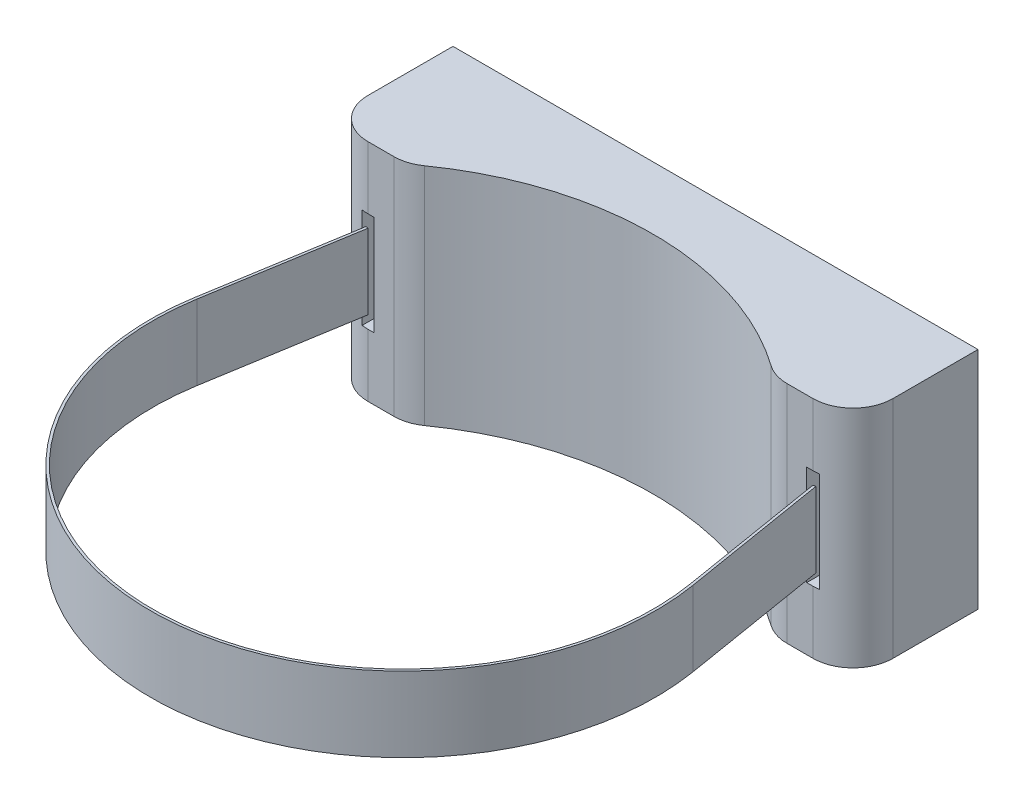
ISO-10303-21;
HEADER;
FILE_DESCRIPTION(('STEP AP214'),'2;1');
FILE_NAME('part.step','',(''),(''),'','','');
FILE_SCHEMA(('AUTOMOTIVE_DESIGN { 1 0 10303 214 1 1 1 1 }'));
ENDSEC;
DATA;
#1=APPLICATION_CONTEXT('core data for automotive mechanical design processes');
#2=APPLICATION_PROTOCOL_DEFINITION('international standard','automotive_design',2000,#1);
#3=PRODUCT_CONTEXT('',#1,'mechanical');
#4=PRODUCT('Part','Part','',(#3));
#5=PRODUCT_RELATED_PRODUCT_CATEGORY('part','',(#4));
#6=PRODUCT_DEFINITION_FORMATION('','',#4);
#7=PRODUCT_DEFINITION_CONTEXT('part definition',#1,'design');
#8=PRODUCT_DEFINITION('design','',#6,#7);
#9=PRODUCT_DEFINITION_SHAPE('','',#8);
#10=(LENGTH_UNIT() NAMED_UNIT(*) SI_UNIT(.MILLI.,.METRE.));
#11=(NAMED_UNIT(*) PLANE_ANGLE_UNIT() SI_UNIT($,.RADIAN.));
#12=(NAMED_UNIT(*) SI_UNIT($,.STERADIAN.) SOLID_ANGLE_UNIT());
#13=UNCERTAINTY_MEASURE_WITH_UNIT(LENGTH_MEASURE(1.E-05),#10,'distance_accuracy_value','');
#14=(GEOMETRIC_REPRESENTATION_CONTEXT(3) GLOBAL_UNCERTAINTY_ASSIGNED_CONTEXT((#13)) GLOBAL_UNIT_ASSIGNED_CONTEXT((#10,
#11,#12)) REPRESENTATION_CONTEXT('',''));
#15=CARTESIAN_POINT('',(0.,0.,0.));
#16=DIRECTION('',(0.,0.,1.));
#17=DIRECTION('',(1.,0.,0.));
#18=AXIS2_PLACEMENT_3D('',#15,#16,#17);
#19=CARTESIAN_POINT('',(114.283135652495,76.2,31.5437209742939));
#20=DIRECTION('',(-0.986720986216434,0.,0.162424429689831));
#21=DIRECTION('',(0.162424429689831,0.,0.986720986216434));
#22=AXIS2_PLACEMENT_3D('',#19,#20,#21);
#23=PLANE('',#22);
#24=DIRECTION('',(-0.162424429689831,0.,-0.986720986216435));
#25=VECTOR('',#24,1.);
#26=CARTESIAN_POINT('',(114.283135652495,38.1,31.5437209742939));
#27=LINE('',#26,#25);
#28=CARTESIAN_POINT('',(126.566700901982,38.1,106.165818403685));
#29=VERTEX_POINT('',#28);
#30=CARTESIAN_POINT('',(114.283135652495,38.1,31.5437209742939));
#31=VERTEX_POINT('',#30);
#32=EDGE_CURVE('E149',#29,#31,#27,.T.);
#33=ORIENTED_EDGE('',*,*,#32,.T.);
#34=DIRECTION('',(0.,-1.,0.));
#35=VECTOR('',#34,1.);
#36=CARTESIAN_POINT('',(114.283135652495,76.2,31.5437209742939));
#37=LINE('',#36,#35);
#38=CARTESIAN_POINT('',(114.283135652495,76.2,31.5437209742939));
#39=VERTEX_POINT('',#38);
#40=EDGE_CURVE('E12',#39,#31,#37,.T.);
#41=ORIENTED_EDGE('',*,*,#40,.F.);
#42=DIRECTION('',(-0.162424429689831,0.,-0.986720986216435));
#43=VECTOR('',#42,1.);
#44=CARTESIAN_POINT('',(114.283135652495,76.2,31.5437209742939));
#45=LINE('',#44,#43);
#46=CARTESIAN_POINT('',(126.566700901982,76.2,106.165818403685));
#47=VERTEX_POINT('',#46);
#48=EDGE_CURVE('E107',#47,#39,#45,.T.);
#49=ORIENTED_EDGE('',*,*,#48,.F.);
#50=DIRECTION('',(0.,-1.,0.));
#51=VECTOR('',#50,1.);
#52=CARTESIAN_POINT('',(126.566700901982,76.2,106.165818403685));
#53=LINE('',#52,#51);
#54=EDGE_CURVE('E148',#47,#29,#53,.T.);
#55=ORIENTED_EDGE('',*,*,#54,.T.);
#56=EDGE_LOOP('',(#33,#41,#49,#55));
#57=FACE_BOUND('',#56,.T.);
#58=ADVANCED_FACE('F52',(#57),#23,.F.);
#59=CARTESIAN_POINT('',(113.03,76.2,31.75));
#60=DIRECTION('',(-0.162424429689833,0.,-0.986720986216434));
#61=DIRECTION('',(-0.986720986216434,0.,0.162424429689833));
#62=AXIS2_PLACEMENT_3D('',#59,#60,#61);
#63=PLANE('',#62);
#64=DIRECTION('',(0.986720986216434,0.,-0.162424429689833));
#65=VECTOR('',#64,1.);
#66=CARTESIAN_POINT('',(113.03,38.1,31.75));
#67=LINE('',#66,#65);
#68=CARTESIAN_POINT('',(113.03,38.1,31.75));
#69=VERTEX_POINT('',#68);
#70=EDGE_CURVE('E152',#69,#31,#67,.T.);
#71=ORIENTED_EDGE('',*,*,#70,.F.);
#72=DIRECTION('',(0.,-1.,0.));
#73=VECTOR('',#72,1.);
#74=CARTESIAN_POINT('',(113.03,76.2,31.75));
#75=LINE('',#74,#73);
#76=CARTESIAN_POINT('',(113.03,76.2,31.75));
#77=VERTEX_POINT('',#76);
#78=EDGE_CURVE('E60',#77,#69,#75,.T.);
#79=ORIENTED_EDGE('',*,*,#78,.F.);
#80=DIRECTION('',(0.986720986216434,0.,-0.162424429689833));
#81=VECTOR('',#80,1.);
#82=CARTESIAN_POINT('',(113.03,76.2,31.75));
#83=LINE('',#82,#81);
#84=EDGE_CURVE('E191',#77,#39,#83,.T.);
#85=ORIENTED_EDGE('',*,*,#84,.T.);
#86=ORIENTED_EDGE('',*,*,#40,.T.);
#87=EDGE_LOOP('',(#71,#79,#85,#86));
#88=FACE_BOUND('',#87,.T.);
#89=ADVANCED_FACE('F182',(#88),#63,.T.);
#90=CARTESIAN_POINT('',(113.03,76.2,31.75));
#91=DIRECTION('',(-0.986720986216434,0.,0.162424429689831));
#92=DIRECTION('',(0.162424429689831,0.,0.986720986216434));
#93=AXIS2_PLACEMENT_3D('',#90,#91,#92);
#94=PLANE('',#93);
#95=DIRECTION('',(-0.162424429689831,0.,-0.986720986216435));
#96=VECTOR('',#95,1.);
#97=CARTESIAN_POINT('',(113.03,38.1,31.75));
#98=LINE('',#97,#96);
#99=CARTESIAN_POINT('',(125.313565249487,38.1,106.372097429391));
#100=VERTEX_POINT('',#99);
#101=EDGE_CURVE('E155',#100,#69,#98,.T.);
#102=ORIENTED_EDGE('',*,*,#101,.F.);
#103=DIRECTION('',(0.,-1.,0.));
#104=VECTOR('',#103,1.);
#105=CARTESIAN_POINT('',(125.313565249487,76.2,106.372097429391));
#106=LINE('',#105,#104);
#107=CARTESIAN_POINT('',(125.313565249487,76.2,106.372097429391));
#108=VERTEX_POINT('',#107);
#109=EDGE_CURVE('E172',#108,#100,#106,.T.);
#110=ORIENTED_EDGE('',*,*,#109,.F.);
#111=DIRECTION('',(-0.162424429689831,0.,-0.986720986216435));
#112=VECTOR('',#111,1.);
#113=CARTESIAN_POINT('',(113.03,76.2,31.75));
#114=LINE('',#113,#112);
#115=EDGE_CURVE('E179',#108,#77,#114,.T.);
#116=ORIENTED_EDGE('',*,*,#115,.T.);
#117=ORIENTED_EDGE('',*,*,#78,.T.);
#118=EDGE_LOOP('',(#102,#110,#116,#117));
#119=FACE_BOUND('',#118,.T.);
#120=ADVANCED_FACE('F177',(#119),#94,.T.);
#121=CARTESIAN_POINT('',(0.,76.2,127.));
#122=DIRECTION('',(0.,-1.,0.));
#123=DIRECTION('',(0.,0.,-1.));
#124=AXIS2_PLACEMENT_3D('',#121,#122,#123);
#125=CYLINDRICAL_SURFACE('',#124,127.);
#126=CARTESIAN_POINT('',(0.,38.1,127.));
#127=DIRECTION('',(0.,1.,0.));
#128=DIRECTION('',(0.,0.,1.));
#129=AXIS2_PLACEMENT_3D('',#126,#127,#128);
#130=CIRCLE('',#129,127.);
#131=CARTESIAN_POINT('',(-125.313565249487,38.1,106.372097429391));
#132=VERTEX_POINT('',#131);
#133=EDGE_CURVE('E158',#132,#100,#130,.T.);
#134=ORIENTED_EDGE('',*,*,#133,.F.);
#135=DIRECTION('',(0.,-1.,0.));
#136=VECTOR('',#135,1.);
#137=CARTESIAN_POINT('',(-125.313565249487,76.2,106.372097429391));
#138=LINE('',#137,#136);
#139=CARTESIAN_POINT('',(-125.313565249487,76.2,106.372097429391));
#140=VERTEX_POINT('',#139);
#141=EDGE_CURVE('E170',#140,#132,#138,.T.);
#142=ORIENTED_EDGE('',*,*,#141,.F.);
#143=CARTESIAN_POINT('',(0.,76.2,127.));
#144=DIRECTION('',(0.,1.,0.));
#145=DIRECTION('',(0.,0.,1.));
#146=AXIS2_PLACEMENT_3D('',#143,#144,#145);
#147=CIRCLE('',#146,127.);
#148=EDGE_CURVE('E143',#140,#108,#147,.T.);
#149=ORIENTED_EDGE('',*,*,#148,.T.);
#150=ORIENTED_EDGE('',*,*,#109,.T.);
#151=EDGE_LOOP('',(#134,#142,#149,#150));
#152=FACE_BOUND('',#151,.T.);
#153=ADVANCED_FACE('F189',(#152),#125,.F.);
#154=CARTESIAN_POINT('',(-113.03,76.2,31.75));
#155=DIRECTION('',(0.986720986216434,0.,0.162424429689831));
#156=DIRECTION('',(0.162424429689831,0.,-0.986720986216435));
#157=AXIS2_PLACEMENT_3D('',#154,#155,#156);
#158=PLANE('',#157);
#159=DIRECTION('',(-0.162424429689831,0.,0.986720986216435));
#160=VECTOR('',#159,1.);
#161=CARTESIAN_POINT('',(-113.03,38.1,31.75));
#162=LINE('',#161,#160);
#163=CARTESIAN_POINT('',(-113.03,38.1,31.75));
#164=VERTEX_POINT('',#163);
#165=EDGE_CURVE('E161',#164,#132,#162,.T.);
#166=ORIENTED_EDGE('',*,*,#165,.F.);
#167=DIRECTION('',(0.,-1.,0.));
#168=VECTOR('',#167,1.);
#169=CARTESIAN_POINT('',(-113.03,76.2,31.75));
#170=LINE('',#169,#168);
#171=CARTESIAN_POINT('',(-113.03,76.2,31.75));
#172=VERTEX_POINT('',#171);
#173=EDGE_CURVE('E131',#172,#164,#170,.T.);
#174=ORIENTED_EDGE('',*,*,#173,.F.);
#175=DIRECTION('',(-0.162424429689831,0.,0.986720986216435));
#176=VECTOR('',#175,1.);
#177=CARTESIAN_POINT('',(-113.03,76.2,31.75));
#178=LINE('',#177,#176);
#179=EDGE_CURVE('E141',#172,#140,#178,.T.);
#180=ORIENTED_EDGE('',*,*,#179,.T.);
#181=ORIENTED_EDGE('',*,*,#141,.T.);
#182=EDGE_LOOP('',(#166,#174,#180,#181));
#183=FACE_BOUND('',#182,.T.);
#184=ADVANCED_FACE('F196',(#183),#158,.T.);
#185=CARTESIAN_POINT('',(-114.283135652495,76.2,31.5437209742939));
#186=DIRECTION('',(0.162424429689833,0.,-0.986720986216434));
#187=DIRECTION('',(-0.986720986216434,0.,-0.162424429689833));
#188=AXIS2_PLACEMENT_3D('',#185,#186,#187);
#189=PLANE('',#188);
#190=DIRECTION('',(0.986720986216434,0.,0.162424429689833));
#191=VECTOR('',#190,1.);
#192=CARTESIAN_POINT('',(-114.283135652495,38.1,31.5437209742939));
#193=LINE('',#192,#191);
#194=CARTESIAN_POINT('',(-114.283135652495,38.1,31.5437209742939));
#195=VERTEX_POINT('',#194);
#196=EDGE_CURVE('E130',#195,#164,#193,.T.);
#197=ORIENTED_EDGE('',*,*,#196,.F.);
#198=DIRECTION('',(0.,-1.,0.));
#199=VECTOR('',#198,1.);
#200=CARTESIAN_POINT('',(-114.283135652495,76.2,31.5437209742939));
#201=LINE('',#200,#199);
#202=CARTESIAN_POINT('',(-114.283135652495,76.2,31.5437209742939));
#203=VERTEX_POINT('',#202);
#204=EDGE_CURVE('E124',#203,#195,#201,.T.);
#205=ORIENTED_EDGE('',*,*,#204,.F.);
#206=DIRECTION('',(0.986720986216434,0.,0.162424429689833));
#207=VECTOR('',#206,1.);
#208=CARTESIAN_POINT('',(-114.283135652495,76.2,31.5437209742939));
#209=LINE('',#208,#207);
#210=EDGE_CURVE('E128',#203,#172,#209,.T.);
#211=ORIENTED_EDGE('',*,*,#210,.T.);
#212=ORIENTED_EDGE('',*,*,#173,.T.);
#213=EDGE_LOOP('',(#197,#205,#211,#212));
#214=FACE_BOUND('',#213,.T.);
#215=ADVANCED_FACE('F126',(#214),#189,.T.);
#216=CARTESIAN_POINT('',(-114.283135652495,76.2,31.5437209742939));
#217=DIRECTION('',(0.986720986216434,0.,0.162424429689831));
#218=DIRECTION('',(0.162424429689831,0.,-0.986720986216435));
#219=AXIS2_PLACEMENT_3D('',#216,#217,#218);
#220=PLANE('',#219);
#221=DIRECTION('',(-0.162424429689831,0.,0.986720986216435));
#222=VECTOR('',#221,1.);
#223=CARTESIAN_POINT('',(-114.283135652495,38.1,31.5437209742939));
#224=LINE('',#223,#222);
#225=CARTESIAN_POINT('',(-126.566700901982,38.1,106.165818403685));
#226=VERTEX_POINT('',#225);
#227=EDGE_CURVE('E95',#195,#226,#224,.T.);
#228=ORIENTED_EDGE('',*,*,#227,.T.);
#229=DIRECTION('',(0.,-1.,0.));
#230=VECTOR('',#229,1.);
#231=CARTESIAN_POINT('',(-126.566700901982,76.2,106.165818403685));
#232=LINE('',#231,#230);
#233=CARTESIAN_POINT('',(-126.566700901982,76.2,106.165818403685));
#234=VERTEX_POINT('',#233);
#235=EDGE_CURVE('E132',#234,#226,#232,.T.);
#236=ORIENTED_EDGE('',*,*,#235,.F.);
#237=DIRECTION('',(-0.162424429689831,0.,0.986720986216435));
#238=VECTOR('',#237,1.);
#239=CARTESIAN_POINT('',(-114.283135652495,76.2,31.5437209742939));
#240=LINE('',#239,#238);
#241=EDGE_CURVE('E134',#203,#234,#240,.T.);
#242=ORIENTED_EDGE('',*,*,#241,.F.);
#243=ORIENTED_EDGE('',*,*,#204,.T.);
#244=EDGE_LOOP('',(#228,#236,#242,#243));
#245=FACE_BOUND('',#244,.T.);
#246=ADVANCED_FACE('F135',(#245),#220,.F.);
#247=CARTESIAN_POINT('',(0.,76.2,127.));
#248=DIRECTION('',(0.,-1.,0.));
#249=DIRECTION('',(0.,0.,-1.));
#250=AXIS2_PLACEMENT_3D('',#247,#248,#249);
#251=CYLINDRICAL_SURFACE('',#250,128.27);
#252=CARTESIAN_POINT('',(0.,38.1,127.));
#253=DIRECTION('',(0.,1.,0.));
#254=DIRECTION('',(1.,0.,0.));
#255=AXIS2_PLACEMENT_3D('',#252,#253,#254);
#256=CIRCLE('',#255,128.27);
#257=EDGE_CURVE('E101',#226,#29,#256,.T.);
#258=ORIENTED_EDGE('',*,*,#257,.T.);
#259=ORIENTED_EDGE('',*,*,#54,.F.);
#260=CARTESIAN_POINT('',(0.,76.2,127.));
#261=DIRECTION('',(0.,1.,0.));
#262=DIRECTION('',(1.,0.,0.));
#263=AXIS2_PLACEMENT_3D('',#260,#261,#262);
#264=CIRCLE('',#263,128.27);
#265=EDGE_CURVE('E68',#234,#47,#264,.T.);
#266=ORIENTED_EDGE('',*,*,#265,.F.);
#267=ORIENTED_EDGE('',*,*,#235,.T.);
#268=EDGE_LOOP('',(#258,#259,#266,#267));
#269=FACE_BOUND('',#268,.T.);
#270=ADVANCED_FACE('F198',(#269),#251,.T.);
#271=CARTESIAN_POINT('',(0.,76.2,127.));
#272=DIRECTION('',(0.,1.,0.));
#273=DIRECTION('',(1.,0.,0.));
#274=AXIS2_PLACEMENT_3D('',#271,#272,#273);
#275=PLANE('',#274);
#276=ORIENTED_EDGE('',*,*,#48,.T.);
#277=ORIENTED_EDGE('',*,*,#84,.F.);
#278=ORIENTED_EDGE('',*,*,#115,.F.);
#279=ORIENTED_EDGE('',*,*,#148,.F.);
#280=ORIENTED_EDGE('',*,*,#179,.F.);
#281=ORIENTED_EDGE('',*,*,#210,.F.);
#282=ORIENTED_EDGE('',*,*,#241,.T.);
#283=ORIENTED_EDGE('',*,*,#265,.T.);
#284=EDGE_LOOP('',(#276,#277,#278,#279,#280,#281,#282,#283));
#285=FACE_BOUND('',#284,.T.);
#286=ADVANCED_FACE('F138',(#285),#275,.T.);
#287=CARTESIAN_POINT('',(0.,38.1,127.));
#288=DIRECTION('',(0.,1.,0.));
#289=DIRECTION('',(1.,0.,0.));
#290=AXIS2_PLACEMENT_3D('',#287,#288,#289);
#291=PLANE('',#290);
#292=ORIENTED_EDGE('',*,*,#32,.F.);
#293=ORIENTED_EDGE('',*,*,#257,.F.);
#294=ORIENTED_EDGE('',*,*,#227,.F.);
#295=ORIENTED_EDGE('',*,*,#196,.T.);
#296=ORIENTED_EDGE('',*,*,#165,.T.);
#297=ORIENTED_EDGE('',*,*,#133,.T.);
#298=ORIENTED_EDGE('',*,*,#101,.T.);
#299=ORIENTED_EDGE('',*,*,#70,.T.);
#300=EDGE_LOOP('',(#292,#293,#294,#295,#296,#297,#298,#299));
#301=FACE_BOUND('',#300,.T.);
#302=ADVANCED_FACE('F185',(#301),#291,.F.);
#303=CLOSED_SHELL('',(#58,#89,#120,#153,#184,#215,#246,#270,#286,#302));
#304=MANIFOLD_SOLID_BREP('B2',#303);
#305=CARTESIAN_POINT('',(93.1092771962064,114.3,31.75));
#306=DIRECTION('',(0.,0.,-1.));
#307=DIRECTION('',(-1.,0.,0.));
#308=AXIS2_PLACEMENT_3D('',#305,#306,#307);
#309=PLANE('',#308);
#310=DIRECTION('',(0.,-1.,0.));
#311=VECTOR('',#310,1.);
#312=CARTESIAN_POINT('',(113.03,114.3,31.75));
#313=LINE('',#312,#311);
#314=CARTESIAN_POINT('',(113.03,0.,31.75));
#315=VERTEX_POINT('',#314);
#316=CARTESIAN_POINT('',(113.03,31.75,31.75));
#317=VERTEX_POINT('',#316);
#318=EDGE_CURVE('E526',#315,#317,#313,.F.);
#319=ORIENTED_EDGE('',*,*,#318,.T.);
#320=DIRECTION('',(1.,0.,0.));
#321=VECTOR('',#320,1.);
#322=CARTESIAN_POINT('',(109.855,31.75,31.75));
#323=LINE('',#322,#321);
#324=CARTESIAN_POINT('',(109.855,31.75,31.75));
#325=VERTEX_POINT('',#324);
#326=EDGE_CURVE('E460',#325,#317,#323,.T.);
#327=ORIENTED_EDGE('',*,*,#326,.F.);
#328=DIRECTION('',(0.,-1.,0.));
#329=VECTOR('',#328,1.);
#330=CARTESIAN_POINT('',(109.855,82.55,31.75));
#331=LINE('',#330,#329);
#332=CARTESIAN_POINT('',(109.855,82.55,31.75));
#333=VERTEX_POINT('',#332);
#334=EDGE_CURVE('E470',#333,#325,#331,.T.);
#335=ORIENTED_EDGE('',*,*,#334,.F.);
#336=DIRECTION('',(-1.,0.,0.));
#337=VECTOR('',#336,1.);
#338=CARTESIAN_POINT('',(109.855,82.55,31.75));
#339=LINE('',#338,#337);
#340=CARTESIAN_POINT('',(113.03,82.55,31.75));
#341=VERTEX_POINT('',#340);
#342=EDGE_CURVE('E468',#341,#333,#339,.T.);
#343=ORIENTED_EDGE('',*,*,#342,.F.);
#344=CARTESIAN_POINT('',(113.03,114.3,31.75));
#345=VERTEX_POINT('',#344);
#346=EDGE_CURVE('E525',#341,#345,#313,.F.);
#347=ORIENTED_EDGE('',*,*,#346,.T.);
#348=DIRECTION('',(1.,0.,0.));
#349=VECTOR('',#348,1.);
#350=CARTESIAN_POINT('',(93.1092771962064,114.3,31.75));
#351=LINE('',#350,#349);
#352=CARTESIAN_POINT('',(99.7980836489359,114.3,31.75));
#353=VERTEX_POINT('',#352);
#354=EDGE_CURVE('E481',#353,#345,#351,.T.);
#355=ORIENTED_EDGE('',*,*,#354,.F.);
#356=DIRECTION('',(0.,-1.,0.));
#357=VECTOR('',#356,1.);
#358=CARTESIAN_POINT('',(99.7980836489359,114.3,31.75));
#359=LINE('',#358,#357);
#360=CARTESIAN_POINT('',(99.7980836489359,0.,31.75));
#361=VERTEX_POINT('',#360);
#362=EDGE_CURVE('E539',#353,#361,#359,.T.);
#363=ORIENTED_EDGE('',*,*,#362,.T.);
#364=DIRECTION('',(1.,0.,0.));
#365=VECTOR('',#364,1.);
#366=CARTESIAN_POINT('',(93.1092771962064,0.,31.75));
#367=LINE('',#366,#365);
#368=EDGE_CURVE('E451',#361,#315,#367,.T.);
#369=ORIENTED_EDGE('',*,*,#368,.T.);
#370=EDGE_LOOP('',(#319,#327,#335,#343,#347,#355,#363,#369));
#371=FACE_BOUND('',#370,.T.);
#372=ADVANCED_FACE('F279',(#371),#309,.F.);
#373=CARTESIAN_POINT('',(133.35,114.3,-31.75));
#374=DIRECTION('',(-1.,0.,0.));
#375=DIRECTION('',(0.,0.,1.));
#376=AXIS2_PLACEMENT_3D('',#373,#374,#375);
#377=PLANE('',#376);
#378=DIRECTION('',(0.,0.,-1.));
#379=VECTOR('',#378,1.);
#380=CARTESIAN_POINT('',(133.35,114.3,-31.75));
#381=LINE('',#380,#379);
#382=CARTESIAN_POINT('',(133.35,114.3,11.43));
#383=VERTEX_POINT('',#382);
#384=CARTESIAN_POINT('',(133.35,114.3,-31.75));
#385=VERTEX_POINT('',#384);
#386=EDGE_CURVE('E484',#383,#385,#381,.T.);
#387=ORIENTED_EDGE('',*,*,#386,.F.);
#388=DIRECTION('',(0.,-1.,0.));
#389=VECTOR('',#388,1.);
#390=CARTESIAN_POINT('',(133.35,114.3,11.43));
#391=LINE('',#390,#389);
#392=CARTESIAN_POINT('',(133.35,0.,11.43));
#393=VERTEX_POINT('',#392);
#394=EDGE_CURVE('E517',#383,#393,#391,.T.);
#395=ORIENTED_EDGE('',*,*,#394,.T.);
#396=DIRECTION('',(0.,0.,-1.));
#397=VECTOR('',#396,1.);
#398=CARTESIAN_POINT('',(133.35,0.,-31.75));
#399=LINE('',#398,#397);
#400=CARTESIAN_POINT('',(133.35,0.,-31.75));
#401=VERTEX_POINT('',#400);
#402=EDGE_CURVE('E500',#393,#401,#399,.T.);
#403=ORIENTED_EDGE('',*,*,#402,.T.);
#404=DIRECTION('',(0.,-1.,0.));
#405=VECTOR('',#404,1.);
#406=CARTESIAN_POINT('',(133.35,114.3,-31.75));
#407=LINE('',#406,#405);
#408=EDGE_CURVE('E514',#385,#401,#407,.T.);
#409=ORIENTED_EDGE('',*,*,#408,.F.);
#410=EDGE_LOOP('',(#387,#395,#403,#409));
#411=FACE_BOUND('',#410,.T.);
#412=ADVANCED_FACE('F598',(#411),#377,.F.);
#413=CARTESIAN_POINT('',(-133.35,114.3,-31.75));
#414=DIRECTION('',(0.,0.,1.));
#415=DIRECTION('',(1.,0.,0.));
#416=AXIS2_PLACEMENT_3D('',#413,#414,#415);
#417=PLANE('',#416);
#418=DIRECTION('',(1.,0.,0.));
#419=VECTOR('',#418,1.);
#420=CARTESIAN_POINT('',(-116.205,31.75,-31.75));
#421=LINE('',#420,#419);
#422=CARTESIAN_POINT('',(-116.205,31.75,-31.75));
#423=VERTEX_POINT('',#422);
#424=CARTESIAN_POINT('',(-109.855,31.75,-31.75));
#425=VERTEX_POINT('',#424);
#426=EDGE_CURVE('E429',#423,#425,#421,.T.);
#427=ORIENTED_EDGE('',*,*,#426,.T.);
#428=DIRECTION('',(0.,1.,0.));
#429=VECTOR('',#428,1.);
#430=CARTESIAN_POINT('',(-109.855,82.55,-31.75));
#431=LINE('',#430,#429);
#432=CARTESIAN_POINT('',(-109.855,82.55,-31.75));
#433=VERTEX_POINT('',#432);
#434=EDGE_CURVE('E422',#425,#433,#431,.T.);
#435=ORIENTED_EDGE('',*,*,#434,.T.);
#436=DIRECTION('',(-1.,0.,0.));
#437=VECTOR('',#436,1.);
#438=CARTESIAN_POINT('',(-116.205,82.55,-31.75));
#439=LINE('',#438,#437);
#440=CARTESIAN_POINT('',(-116.205,82.55,-31.75));
#441=VERTEX_POINT('',#440);
#442=EDGE_CURVE('E432',#433,#441,#439,.T.);
#443=ORIENTED_EDGE('',*,*,#442,.T.);
#444=DIRECTION('',(0.,-1.,0.));
#445=VECTOR('',#444,1.);
#446=CARTESIAN_POINT('',(-116.205,82.55,-31.75));
#447=LINE('',#446,#445);
#448=EDGE_CURVE('E294',#441,#423,#447,.T.);
#449=ORIENTED_EDGE('',*,*,#448,.T.);
#450=EDGE_LOOP('',(#427,#435,#443,#449));
#451=FACE_BOUND('',#450,.T.);
#452=DIRECTION('',(1.,0.,0.));
#453=VECTOR('',#452,1.);
#454=CARTESIAN_POINT('',(109.855,31.75,-31.75));
#455=LINE('',#454,#453);
#456=CARTESIAN_POINT('',(109.855,31.75,-31.75));
#457=VERTEX_POINT('',#456);
#458=CARTESIAN_POINT('',(116.205,31.75,-31.75));
#459=VERTEX_POINT('',#458);
#460=EDGE_CURVE('E464',#457,#459,#455,.T.);
#461=ORIENTED_EDGE('',*,*,#460,.T.);
#462=DIRECTION('',(0.,1.,0.));
#463=VECTOR('',#462,1.);
#464=CARTESIAN_POINT('',(116.205,82.55,-31.75));
#465=LINE('',#464,#463);
#466=CARTESIAN_POINT('',(116.205,82.55,-31.75));
#467=VERTEX_POINT('',#466);
#468=EDGE_CURVE('E456',#459,#467,#465,.T.);
#469=ORIENTED_EDGE('',*,*,#468,.T.);
#470=DIRECTION('',(-1.,0.,0.));
#471=VECTOR('',#470,1.);
#472=CARTESIAN_POINT('',(109.855,82.55,-31.75));
#473=LINE('',#472,#471);
#474=CARTESIAN_POINT('',(109.855,82.55,-31.75));
#475=VERTEX_POINT('',#474);
#476=EDGE_CURVE('E459',#467,#475,#473,.T.);
#477=ORIENTED_EDGE('',*,*,#476,.T.);
#478=DIRECTION('',(0.,-1.,0.));
#479=VECTOR('',#478,1.);
#480=CARTESIAN_POINT('',(109.855,82.55,-31.75));
#481=LINE('',#480,#479);
#482=EDGE_CURVE('E302',#475,#457,#481,.T.);
#483=ORIENTED_EDGE('',*,*,#482,.T.);
#484=EDGE_LOOP('',(#461,#469,#477,#483));
#485=FACE_BOUND('',#484,.T.);
#486=DIRECTION('',(-1.,0.,0.));
#487=VECTOR('',#486,1.);
#488=CARTESIAN_POINT('',(-133.35,0.,-31.75));
#489=LINE('',#488,#487);
#490=CARTESIAN_POINT('',(-133.35,0.,-31.75));
#491=VERTEX_POINT('',#490);
#492=EDGE_CURVE('E502',#401,#491,#489,.T.);
#493=ORIENTED_EDGE('',*,*,#492,.T.);
#494=DIRECTION('',(0.,-1.,0.));
#495=VECTOR('',#494,1.);
#496=CARTESIAN_POINT('',(-133.35,114.3,-31.75));
#497=LINE('',#496,#495);
#498=CARTESIAN_POINT('',(-133.35,114.3,-31.75));
#499=VERTEX_POINT('',#498);
#500=EDGE_CURVE('E498',#499,#491,#497,.T.);
#501=ORIENTED_EDGE('',*,*,#500,.F.);
#502=DIRECTION('',(-1.,0.,0.));
#503=VECTOR('',#502,1.);
#504=CARTESIAN_POINT('',(-133.35,114.3,-31.75));
#505=LINE('',#504,#503);
#506=EDGE_CURVE('E487',#385,#499,#505,.T.);
#507=ORIENTED_EDGE('',*,*,#506,.F.);
#508=ORIENTED_EDGE('',*,*,#408,.T.);
#509=EDGE_LOOP('',(#493,#501,#507,#508));
#510=FACE_BOUND('',#509,.T.);
#511=ADVANCED_FACE('F436',(#451,#485,#510),#417,.F.);
#512=CARTESIAN_POINT('',(-133.35,114.3,-31.75));
#513=DIRECTION('',(1.,0.,0.));
#514=DIRECTION('',(0.,0.,-1.));
#515=AXIS2_PLACEMENT_3D('',#512,#513,#514);
#516=PLANE('',#515);
#517=DIRECTION('',(0.,0.,1.));
#518=VECTOR('',#517,1.);
#519=CARTESIAN_POINT('',(-133.35,0.,-31.75));
#520=LINE('',#519,#518);
#521=CARTESIAN_POINT('',(-133.35,0.,11.43));
#522=VERTEX_POINT('',#521);
#523=EDGE_CURVE('E504',#491,#522,#520,.T.);
#524=ORIENTED_EDGE('',*,*,#523,.T.);
#525=DIRECTION('',(0.,-1.,0.));
#526=VECTOR('',#525,1.);
#527=CARTESIAN_POINT('',(-133.35,114.3,11.43));
#528=LINE('',#527,#526);
#529=CARTESIAN_POINT('',(-133.35,114.3,11.43));
#530=VERTEX_POINT('',#529);
#531=EDGE_CURVE('E537',#522,#530,#528,.F.);
#532=ORIENTED_EDGE('',*,*,#531,.T.);
#533=DIRECTION('',(0.,0.,1.));
#534=VECTOR('',#533,1.);
#535=CARTESIAN_POINT('',(-133.35,114.3,-31.75));
#536=LINE('',#535,#534);
#537=EDGE_CURVE('E489',#499,#530,#536,.T.);
#538=ORIENTED_EDGE('',*,*,#537,.F.);
#539=ORIENTED_EDGE('',*,*,#500,.T.);
#540=EDGE_LOOP('',(#524,#532,#538,#539));
#541=FACE_BOUND('',#540,.T.);
#542=ADVANCED_FACE('F630',(#541),#516,.F.);
#543=CARTESIAN_POINT('',(-133.35,114.3,31.75));
#544=DIRECTION('',(0.,0.,-1.));
#545=DIRECTION('',(-1.,0.,0.));
#546=AXIS2_PLACEMENT_3D('',#543,#544,#545);
#547=PLANE('',#546);
#548=DIRECTION('',(0.,1.,0.));
#549=VECTOR('',#548,1.);
#550=CARTESIAN_POINT('',(-109.855,82.55,31.75));
#551=LINE('',#550,#549);
#552=CARTESIAN_POINT('',(-109.855,31.75,31.75));
#553=VERTEX_POINT('',#552);
#554=CARTESIAN_POINT('',(-109.855,82.55,31.75));
#555=VERTEX_POINT('',#554);
#556=EDGE_CURVE('E425',#553,#555,#551,.T.);
#557=ORIENTED_EDGE('',*,*,#556,.F.);
#558=DIRECTION('',(1.,0.,0.));
#559=VECTOR('',#558,1.);
#560=CARTESIAN_POINT('',(-116.205,31.75,31.75));
#561=LINE('',#560,#559);
#562=CARTESIAN_POINT('',(-113.03,31.75,31.75));
#563=VERTEX_POINT('',#562);
#564=EDGE_CURVE('E439',#563,#553,#561,.T.);
#565=ORIENTED_EDGE('',*,*,#564,.F.);
#566=DIRECTION('',(0.,-1.,0.));
#567=VECTOR('',#566,1.);
#568=CARTESIAN_POINT('',(-113.03,114.3,31.75));
#569=LINE('',#568,#567);
#570=CARTESIAN_POINT('',(-113.03,0.,31.75));
#571=VERTEX_POINT('',#570);
#572=EDGE_CURVE('E533',#563,#571,#569,.T.);
#573=ORIENTED_EDGE('',*,*,#572,.T.);
#574=DIRECTION('',(1.,0.,0.));
#575=VECTOR('',#574,1.);
#576=CARTESIAN_POINT('',(-133.35,0.,31.75));
#577=LINE('',#576,#575);
#578=CARTESIAN_POINT('',(-99.7980836489359,0.,31.75));
#579=VERTEX_POINT('',#578);
#580=EDGE_CURVE('E507',#571,#579,#577,.T.);
#581=ORIENTED_EDGE('',*,*,#580,.T.);
#582=DIRECTION('',(0.,-1.,0.));
#583=VECTOR('',#582,1.);
#584=CARTESIAN_POINT('',(-99.7980836489359,114.3,31.75));
#585=LINE('',#584,#583);
#586=CARTESIAN_POINT('',(-99.7980836489359,114.3,31.75));
#587=VERTEX_POINT('',#586);
#588=EDGE_CURVE('E555',#579,#587,#585,.F.);
#589=ORIENTED_EDGE('',*,*,#588,.T.);
#590=DIRECTION('',(1.,0.,0.));
#591=VECTOR('',#590,1.);
#592=CARTESIAN_POINT('',(-133.35,114.3,31.75));
#593=LINE('',#592,#591);
#594=CARTESIAN_POINT('',(-113.03,114.3,31.75));
#595=VERTEX_POINT('',#594);
#596=EDGE_CURVE('E492',#595,#587,#593,.T.);
#597=ORIENTED_EDGE('',*,*,#596,.F.);
#598=CARTESIAN_POINT('',(-113.03,82.55,31.75));
#599=VERTEX_POINT('',#598);
#600=EDGE_CURVE('E534',#595,#599,#569,.T.);
#601=ORIENTED_EDGE('',*,*,#600,.T.);
#602=DIRECTION('',(-1.,0.,0.));
#603=VECTOR('',#602,1.);
#604=CARTESIAN_POINT('',(-116.205,82.55,31.75));
#605=LINE('',#604,#603);
#606=EDGE_CURVE('E441',#555,#599,#605,.T.);
#607=ORIENTED_EDGE('',*,*,#606,.F.);
#608=EDGE_LOOP('',(#557,#565,#573,#581,#589,#597,#601,#607));
#609=FACE_BOUND('',#608,.T.);
#610=ADVANCED_FACE('F618',(#609),#547,.F.);
#611=CARTESIAN_POINT('',(0.,114.3,152.4));
#612=DIRECTION('',(0.,-1.,0.));
#613=DIRECTION('',(0.,0.,-1.));
#614=AXIS2_PLACEMENT_3D('',#611,#612,#613);
#615=CYLINDRICAL_SURFACE('',#614,152.4);
#616=CARTESIAN_POINT('',(0.,0.,152.4));
#617=DIRECTION('',(0.,-1.,0.));
#618=DIRECTION('',(0.,0.,1.));
#619=AXIS2_PLACEMENT_3D('',#616,#617,#618);
#620=CIRCLE('',#619,152.4);
#621=CARTESIAN_POINT('',(-88.057132631414,0.,28.0147058823529));
#622=VERTEX_POINT('',#621);
#623=CARTESIAN_POINT('',(88.0571326314141,0.,28.0147058823529));
#624=VERTEX_POINT('',#623);
#625=EDGE_CURVE('E485',#622,#624,#620,.T.);
#626=ORIENTED_EDGE('',*,*,#625,.T.);
#627=DIRECTION('',(0.,-1.,0.));
#628=VECTOR('',#627,1.);
#629=CARTESIAN_POINT('',(88.0571326314141,114.3,28.0147058823529));
#630=LINE('',#629,#628);
#631=CARTESIAN_POINT('',(88.0571326314141,114.3,28.0147058823529));
#632=VERTEX_POINT('',#631);
#633=EDGE_CURVE('E549',#624,#632,#630,.F.);
#634=ORIENTED_EDGE('',*,*,#633,.T.);
#635=CARTESIAN_POINT('',(0.,114.3,152.4));
#636=DIRECTION('',(0.,-1.,0.));
#637=DIRECTION('',(0.,0.,1.));
#638=AXIS2_PLACEMENT_3D('',#635,#636,#637);
#639=CIRCLE('',#638,152.4);
#640=CARTESIAN_POINT('',(-88.057132631414,114.3,28.0147058823529));
#641=VERTEX_POINT('',#640);
#642=EDGE_CURVE('E495',#641,#632,#639,.T.);
#643=ORIENTED_EDGE('',*,*,#642,.F.);
#644=DIRECTION('',(0.,-1.,0.));
#645=VECTOR('',#644,1.);
#646=CARTESIAN_POINT('',(-88.057132631414,114.3,28.0147058823529));
#647=LINE('',#646,#645);
#648=EDGE_CURVE('E546',#641,#622,#647,.T.);
#649=ORIENTED_EDGE('',*,*,#648,.T.);
#650=EDGE_LOOP('',(#626,#634,#643,#649));
#651=FACE_BOUND('',#650,.T.);
#652=ADVANCED_FACE('F610',(#651),#615,.F.);
#653=CARTESIAN_POINT('',(0.,114.3,152.4));
#654=DIRECTION('',(0.,1.,0.));
#655=DIRECTION('',(0.,0.,1.));
#656=AXIS2_PLACEMENT_3D('',#653,#654,#655);
#657=PLANE('',#656);
#658=ORIENTED_EDGE('',*,*,#642,.T.);
#659=CARTESIAN_POINT('',(99.7980836489359,114.3,11.43));
#660=DIRECTION('',(0.,1.,0.));
#661=DIRECTION('',(0.,0.,1.));
#662=AXIS2_PLACEMENT_3D('',#659,#660,#661);
#663=CIRCLE('',#662,20.32);
#664=EDGE_CURVE('E553',#632,#353,#663,.T.);
#665=ORIENTED_EDGE('',*,*,#664,.T.);
#666=ORIENTED_EDGE('',*,*,#354,.T.);
#667=CARTESIAN_POINT('',(113.03,114.3,11.43));
#668=DIRECTION('',(0.,1.,0.));
#669=DIRECTION('',(0.,0.,1.));
#670=AXIS2_PLACEMENT_3D('',#667,#668,#669);
#671=CIRCLE('',#670,20.32);
#672=EDGE_CURVE('E531',#345,#383,#671,.T.);
#673=ORIENTED_EDGE('',*,*,#672,.T.);
#674=ORIENTED_EDGE('',*,*,#386,.T.);
#675=ORIENTED_EDGE('',*,*,#506,.T.);
#676=ORIENTED_EDGE('',*,*,#537,.T.);
#677=CARTESIAN_POINT('',(-113.03,114.3,11.43));
#678=DIRECTION('',(0.,1.,0.));
#679=DIRECTION('',(0.,0.,1.));
#680=AXIS2_PLACEMENT_3D('',#677,#678,#679);
#681=CIRCLE('',#680,20.32);
#682=EDGE_CURVE('E529',#530,#595,#681,.T.);
#683=ORIENTED_EDGE('',*,*,#682,.T.);
#684=ORIENTED_EDGE('',*,*,#596,.T.);
#685=CARTESIAN_POINT('',(-99.7980836489359,114.3,11.43));
#686=DIRECTION('',(0.,1.,0.));
#687=DIRECTION('',(0.,0.,1.));
#688=AXIS2_PLACEMENT_3D('',#685,#686,#687);
#689=CIRCLE('',#688,20.32);
#690=EDGE_CURVE('E551',#587,#641,#689,.T.);
#691=ORIENTED_EDGE('',*,*,#690,.T.);
#692=EDGE_LOOP('',(#658,#665,#666,#673,#674,#675,#676,#683,#684,#691));
#693=FACE_BOUND('',#692,.T.);
#694=ADVANCED_FACE('F602',(#693),#657,.T.);
#695=CARTESIAN_POINT('',(0.,0.,152.4));
#696=DIRECTION('',(0.,1.,0.));
#697=DIRECTION('',(0.,0.,1.));
#698=AXIS2_PLACEMENT_3D('',#695,#696,#697);
#699=PLANE('',#698);
#700=ORIENTED_EDGE('',*,*,#368,.F.);
#701=CARTESIAN_POINT('',(99.7980836489359,0.,11.43));
#702=DIRECTION('',(0.,1.,0.));
#703=DIRECTION('',(0.,0.,1.));
#704=AXIS2_PLACEMENT_3D('',#701,#702,#703);
#705=CIRCLE('',#704,20.32);
#706=EDGE_CURVE('E544',#361,#624,#705,.F.);
#707=ORIENTED_EDGE('',*,*,#706,.T.);
#708=ORIENTED_EDGE('',*,*,#625,.F.);
#709=CARTESIAN_POINT('',(-99.7980836489359,0.,11.43));
#710=DIRECTION('',(0.,1.,0.));
#711=DIRECTION('',(0.,0.,1.));
#712=AXIS2_PLACEMENT_3D('',#709,#710,#711);
#713=CIRCLE('',#712,20.32);
#714=EDGE_CURVE('E542',#622,#579,#713,.F.);
#715=ORIENTED_EDGE('',*,*,#714,.T.);
#716=ORIENTED_EDGE('',*,*,#580,.F.);
#717=CARTESIAN_POINT('',(-113.03,0.,11.43));
#718=DIRECTION('',(0.,1.,0.));
#719=DIRECTION('',(0.,0.,1.));
#720=AXIS2_PLACEMENT_3D('',#717,#718,#719);
#721=CIRCLE('',#720,20.32);
#722=EDGE_CURVE('E520',#571,#522,#721,.F.);
#723=ORIENTED_EDGE('',*,*,#722,.T.);
#724=ORIENTED_EDGE('',*,*,#523,.F.);
#725=ORIENTED_EDGE('',*,*,#492,.F.);
#726=ORIENTED_EDGE('',*,*,#402,.F.);
#727=CARTESIAN_POINT('',(113.03,0.,11.43));
#728=DIRECTION('',(0.,1.,0.));
#729=DIRECTION('',(0.,0.,1.));
#730=AXIS2_PLACEMENT_3D('',#727,#728,#729);
#731=CIRCLE('',#730,20.32);
#732=EDGE_CURVE('E522',#393,#315,#731,.F.);
#733=ORIENTED_EDGE('',*,*,#732,.T.);
#734=EDGE_LOOP('',(#700,#707,#708,#715,#716,#723,#724,#725,#726,#733));
#735=FACE_BOUND('',#734,.T.);
#736=ADVANCED_FACE('F593',(#735),#699,.F.);
#737=CARTESIAN_POINT('',(113.03,114.3,11.43));
#738=DIRECTION('',(0.,-1.,0.));
#739=DIRECTION('',(0.,0.,-1.));
#740=AXIS2_PLACEMENT_3D('',#737,#738,#739);
#741=CYLINDRICAL_SURFACE('',#740,20.32);
#742=CARTESIAN_POINT('',(113.03,31.75,11.43));
#743=DIRECTION('',(0.,-1.,0.));
#744=DIRECTION('',(0.,0.,-1.));
#745=AXIS2_PLACEMENT_3D('',#742,#743,#744);
#746=CIRCLE('',#745,20.32);
#747=CARTESIAN_POINT('',(116.205,31.75,31.5004203991845));
#748=VERTEX_POINT('',#747);
#749=EDGE_CURVE('E50',#317,#748,#746,.F.);
#750=ORIENTED_EDGE('',*,*,#749,.F.);
#751=ORIENTED_EDGE('',*,*,#318,.F.);
#752=ORIENTED_EDGE('',*,*,#732,.F.);
#753=ORIENTED_EDGE('',*,*,#394,.F.);
#754=ORIENTED_EDGE('',*,*,#672,.F.);
#755=ORIENTED_EDGE('',*,*,#346,.F.);
#756=CARTESIAN_POINT('',(113.03,82.55,11.43));
#757=DIRECTION('',(0.,1.,0.));
#758=DIRECTION('',(0.,0.,1.));
#759=AXIS2_PLACEMENT_3D('',#756,#757,#758);
#760=CIRCLE('',#759,20.32);
#761=CARTESIAN_POINT('',(116.205,82.55,31.5004203991845));
#762=VERTEX_POINT('',#761);
#763=EDGE_CURVE('E563',#762,#341,#760,.F.);
#764=ORIENTED_EDGE('',*,*,#763,.F.);
#765=DIRECTION('',(0.,-1.,0.));
#766=VECTOR('',#765,1.);
#767=CARTESIAN_POINT('',(116.205,114.3,31.5004203991845));
#768=LINE('',#767,#766);
#769=EDGE_CURVE('E287',#748,#762,#768,.F.);
#770=ORIENTED_EDGE('',*,*,#769,.F.);
#771=EDGE_LOOP('',(#750,#751,#752,#753,#754,#755,#764,#770));
#772=FACE_BOUND('',#771,.T.);
#773=ADVANCED_FACE('F574',(#772),#741,.T.);
#774=CARTESIAN_POINT('',(-113.03,114.3,11.43));
#775=DIRECTION('',(0.,-1.,0.));
#776=DIRECTION('',(0.,0.,-1.));
#777=AXIS2_PLACEMENT_3D('',#774,#775,#776);
#778=CYLINDRICAL_SURFACE('',#777,20.32);
#779=CARTESIAN_POINT('',(-113.03,31.75,11.43));
#780=DIRECTION('',(0.,-1.,0.));
#781=DIRECTION('',(0.,0.,-1.));
#782=AXIS2_PLACEMENT_3D('',#779,#780,#781);
#783=CIRCLE('',#782,20.32);
#784=CARTESIAN_POINT('',(-116.205,31.75,31.5004203991844));
#785=VERTEX_POINT('',#784);
#786=EDGE_CURVE('E561',#785,#563,#783,.F.);
#787=ORIENTED_EDGE('',*,*,#786,.F.);
#788=DIRECTION('',(0.,-1.,0.));
#789=VECTOR('',#788,1.);
#790=CARTESIAN_POINT('',(-116.205,114.3,31.5004203991844));
#791=LINE('',#790,#789);
#792=CARTESIAN_POINT('',(-116.205,82.55,31.5004203991844));
#793=VERTEX_POINT('',#792);
#794=EDGE_CURVE('E559',#793,#785,#791,.T.);
#795=ORIENTED_EDGE('',*,*,#794,.F.);
#796=CARTESIAN_POINT('',(-113.03,82.55,11.43));
#797=DIRECTION('',(0.,1.,0.));
#798=DIRECTION('',(0.,0.,1.));
#799=AXIS2_PLACEMENT_3D('',#796,#797,#798);
#800=CIRCLE('',#799,20.32);
#801=EDGE_CURVE('E557',#599,#793,#800,.F.);
#802=ORIENTED_EDGE('',*,*,#801,.F.);
#803=ORIENTED_EDGE('',*,*,#600,.F.);
#804=ORIENTED_EDGE('',*,*,#682,.F.);
#805=ORIENTED_EDGE('',*,*,#531,.F.);
#806=ORIENTED_EDGE('',*,*,#722,.F.);
#807=ORIENTED_EDGE('',*,*,#572,.F.);
#808=EDGE_LOOP('',(#787,#795,#802,#803,#804,#805,#806,#807));
#809=FACE_BOUND('',#808,.T.);
#810=ADVANCED_FACE('F626',(#809),#778,.T.);
#811=CARTESIAN_POINT('',(99.7980836489359,114.3,11.43));
#812=DIRECTION('',(0.,-1.,0.));
#813=DIRECTION('',(0.,0.,-1.));
#814=AXIS2_PLACEMENT_3D('',#811,#812,#813);
#815=CYLINDRICAL_SURFACE('',#814,20.32);
#816=ORIENTED_EDGE('',*,*,#664,.F.);
#817=ORIENTED_EDGE('',*,*,#633,.F.);
#818=ORIENTED_EDGE('',*,*,#706,.F.);
#819=ORIENTED_EDGE('',*,*,#362,.F.);
#820=EDGE_LOOP('',(#816,#817,#818,#819));
#821=FACE_BOUND('',#820,.T.);
#822=ADVANCED_FACE('F606',(#821),#815,.T.);
#823=CARTESIAN_POINT('',(-99.7980836489359,114.3,11.43));
#824=DIRECTION('',(0.,-1.,0.));
#825=DIRECTION('',(0.,0.,-1.));
#826=AXIS2_PLACEMENT_3D('',#823,#824,#825);
#827=CYLINDRICAL_SURFACE('',#826,20.32);
#828=ORIENTED_EDGE('',*,*,#690,.F.);
#829=ORIENTED_EDGE('',*,*,#588,.F.);
#830=ORIENTED_EDGE('',*,*,#714,.F.);
#831=ORIENTED_EDGE('',*,*,#648,.F.);
#832=EDGE_LOOP('',(#828,#829,#830,#831));
#833=FACE_BOUND('',#832,.T.);
#834=ADVANCED_FACE('F281',(#833),#827,.T.);
#835=CARTESIAN_POINT('',(-109.855,82.55,-31.75));
#836=DIRECTION('',(1.,0.,0.));
#837=DIRECTION('',(0.,1.,0.));
#838=AXIS2_PLACEMENT_3D('',#835,#836,#837);
#839=PLANE('',#838);
#840=ORIENTED_EDGE('',*,*,#556,.T.);
#841=DIRECTION('',(0.,0.,1.));
#842=VECTOR('',#841,1.);
#843=CARTESIAN_POINT('',(-109.855,82.55,-31.75));
#844=LINE('',#843,#842);
#845=EDGE_CURVE('E417',#433,#555,#844,.T.);
#846=ORIENTED_EDGE('',*,*,#845,.F.);
#847=ORIENTED_EDGE('',*,*,#434,.F.);
#848=DIRECTION('',(0.,0.,1.));
#849=VECTOR('',#848,1.);
#850=CARTESIAN_POINT('',(-109.855,31.75,-31.75));
#851=LINE('',#850,#849);
#852=EDGE_CURVE('E449',#425,#553,#851,.T.);
#853=ORIENTED_EDGE('',*,*,#852,.T.);
#854=EDGE_LOOP('',(#840,#846,#847,#853));
#855=FACE_BOUND('',#854,.T.);
#856=ADVANCED_FACE('F419',(#855),#839,.F.);
#857=CARTESIAN_POINT('',(-116.205,31.75,-31.75));
#858=DIRECTION('',(0.,-1.,0.));
#859=DIRECTION('',(0.,0.,-1.));
#860=AXIS2_PLACEMENT_3D('',#857,#858,#859);
#861=PLANE('',#860);
#862=ORIENTED_EDGE('',*,*,#786,.T.);
#863=ORIENTED_EDGE('',*,*,#564,.T.);
#864=ORIENTED_EDGE('',*,*,#852,.F.);
#865=ORIENTED_EDGE('',*,*,#426,.F.);
#866=DIRECTION('',(0.,0.,1.));
#867=VECTOR('',#866,1.);
#868=CARTESIAN_POINT('',(-116.205,31.75,-31.75));
#869=LINE('',#868,#867);
#870=EDGE_CURVE('E452',#423,#785,#869,.T.);
#871=ORIENTED_EDGE('',*,*,#870,.T.);
#872=EDGE_LOOP('',(#862,#863,#864,#865,#871));
#873=FACE_BOUND('',#872,.T.);
#874=ADVANCED_FACE('F655',(#873),#861,.F.);
#875=CARTESIAN_POINT('',(-116.205,82.55,-31.75));
#876=DIRECTION('',(-1.,0.,0.));
#877=DIRECTION('',(0.,0.,1.));
#878=AXIS2_PLACEMENT_3D('',#875,#876,#877);
#879=PLANE('',#878);
#880=ORIENTED_EDGE('',*,*,#794,.T.);
#881=ORIENTED_EDGE('',*,*,#870,.F.);
#882=ORIENTED_EDGE('',*,*,#448,.F.);
#883=DIRECTION('',(0.,0.,1.));
#884=VECTOR('',#883,1.);
#885=CARTESIAN_POINT('',(-116.205,82.55,-31.75));
#886=LINE('',#885,#884);
#887=EDGE_CURVE('E428',#441,#793,#886,.T.);
#888=ORIENTED_EDGE('',*,*,#887,.T.);
#889=EDGE_LOOP('',(#880,#881,#882,#888));
#890=FACE_BOUND('',#889,.T.);
#891=ADVANCED_FACE('F660',(#890),#879,.F.);
#892=CARTESIAN_POINT('',(-116.205,82.55,-31.75));
#893=DIRECTION('',(0.,1.,0.));
#894=DIRECTION('',(0.,0.,1.));
#895=AXIS2_PLACEMENT_3D('',#892,#893,#894);
#896=PLANE('',#895);
#897=ORIENTED_EDGE('',*,*,#801,.T.);
#898=ORIENTED_EDGE('',*,*,#887,.F.);
#899=ORIENTED_EDGE('',*,*,#442,.F.);
#900=ORIENTED_EDGE('',*,*,#845,.T.);
#901=ORIENTED_EDGE('',*,*,#606,.T.);
#902=EDGE_LOOP('',(#897,#898,#899,#900,#901));
#903=FACE_BOUND('',#902,.T.);
#904=ADVANCED_FACE('F433',(#903),#896,.F.);
#905=CARTESIAN_POINT('',(116.205,82.55,-31.75));
#906=DIRECTION('',(1.,0.,0.));
#907=DIRECTION('',(0.,0.,-1.));
#908=AXIS2_PLACEMENT_3D('',#905,#906,#907);
#909=PLANE('',#908);
#910=ORIENTED_EDGE('',*,*,#769,.T.);
#911=DIRECTION('',(0.,0.,1.));
#912=VECTOR('',#911,1.);
#913=CARTESIAN_POINT('',(116.205,82.55,-31.75));
#914=LINE('',#913,#912);
#915=EDGE_CURVE('E467',#467,#762,#914,.T.);
#916=ORIENTED_EDGE('',*,*,#915,.F.);
#917=ORIENTED_EDGE('',*,*,#468,.F.);
#918=DIRECTION('',(0.,0.,1.));
#919=VECTOR('',#918,1.);
#920=CARTESIAN_POINT('',(116.205,31.75,-31.75));
#921=LINE('',#920,#919);
#922=EDGE_CURVE('E447',#459,#748,#921,.T.);
#923=ORIENTED_EDGE('',*,*,#922,.T.);
#924=EDGE_LOOP('',(#910,#916,#917,#923));
#925=FACE_BOUND('',#924,.T.);
#926=ADVANCED_FACE('F568',(#925),#909,.F.);
#927=CARTESIAN_POINT('',(109.855,31.75,-31.75));
#928=DIRECTION('',(0.,-1.,0.));
#929=DIRECTION('',(0.,0.,-1.));
#930=AXIS2_PLACEMENT_3D('',#927,#928,#929);
#931=PLANE('',#930);
#932=ORIENTED_EDGE('',*,*,#749,.T.);
#933=ORIENTED_EDGE('',*,*,#922,.F.);
#934=ORIENTED_EDGE('',*,*,#460,.F.);
#935=DIRECTION('',(0.,0.,1.));
#936=VECTOR('',#935,1.);
#937=CARTESIAN_POINT('',(109.855,31.75,-31.75));
#938=LINE('',#937,#936);
#939=EDGE_CURVE('E476',#457,#325,#938,.T.);
#940=ORIENTED_EDGE('',*,*,#939,.T.);
#941=ORIENTED_EDGE('',*,*,#326,.T.);
#942=EDGE_LOOP('',(#932,#933,#934,#940,#941));
#943=FACE_BOUND('',#942,.T.);
#944=ADVANCED_FACE('F587',(#943),#931,.F.);
#945=CARTESIAN_POINT('',(109.855,82.55,-31.75));
#946=DIRECTION('',(-1.,0.,0.));
#947=DIRECTION('',(0.,0.,1.));
#948=AXIS2_PLACEMENT_3D('',#945,#946,#947);
#949=PLANE('',#948);
#950=ORIENTED_EDGE('',*,*,#334,.T.);
#951=ORIENTED_EDGE('',*,*,#939,.F.);
#952=ORIENTED_EDGE('',*,*,#482,.F.);
#953=DIRECTION('',(0.,0.,1.));
#954=VECTOR('',#953,1.);
#955=CARTESIAN_POINT('',(109.855,82.55,-31.75));
#956=LINE('',#955,#954);
#957=EDGE_CURVE('E478',#475,#333,#956,.T.);
#958=ORIENTED_EDGE('',*,*,#957,.T.);
#959=EDGE_LOOP('',(#950,#951,#952,#958));
#960=FACE_BOUND('',#959,.T.);
#961=ADVANCED_FACE('F583',(#960),#949,.F.);
#962=CARTESIAN_POINT('',(109.855,82.55,-31.75));
#963=DIRECTION('',(0.,1.,0.));
#964=DIRECTION('',(0.,0.,1.));
#965=AXIS2_PLACEMENT_3D('',#962,#963,#964);
#966=PLANE('',#965);
#967=ORIENTED_EDGE('',*,*,#763,.T.);
#968=ORIENTED_EDGE('',*,*,#342,.T.);
#969=ORIENTED_EDGE('',*,*,#957,.F.);
#970=ORIENTED_EDGE('',*,*,#476,.F.);
#971=ORIENTED_EDGE('',*,*,#915,.T.);
#972=EDGE_LOOP('',(#967,#968,#969,#970,#971));
#973=FACE_BOUND('',#972,.T.);
#974=ADVANCED_FACE('F578',(#973),#966,.F.);
#975=CLOSED_SHELL('',(#372,#412,#511,#542,#610,#652,#694,#736,#773,#810,#822,#834,#856,#874,
#891,#904,#926,#944,#961,#974));
#976=MANIFOLD_SOLID_BREP('B6',#975);
#977=ADVANCED_BREP_SHAPE_REPRESENTATION('',(#18,#304,#976),#14);
#978=SHAPE_DEFINITION_REPRESENTATION(#9,#977);
ENDSEC;
END-ISO-10303-21;
